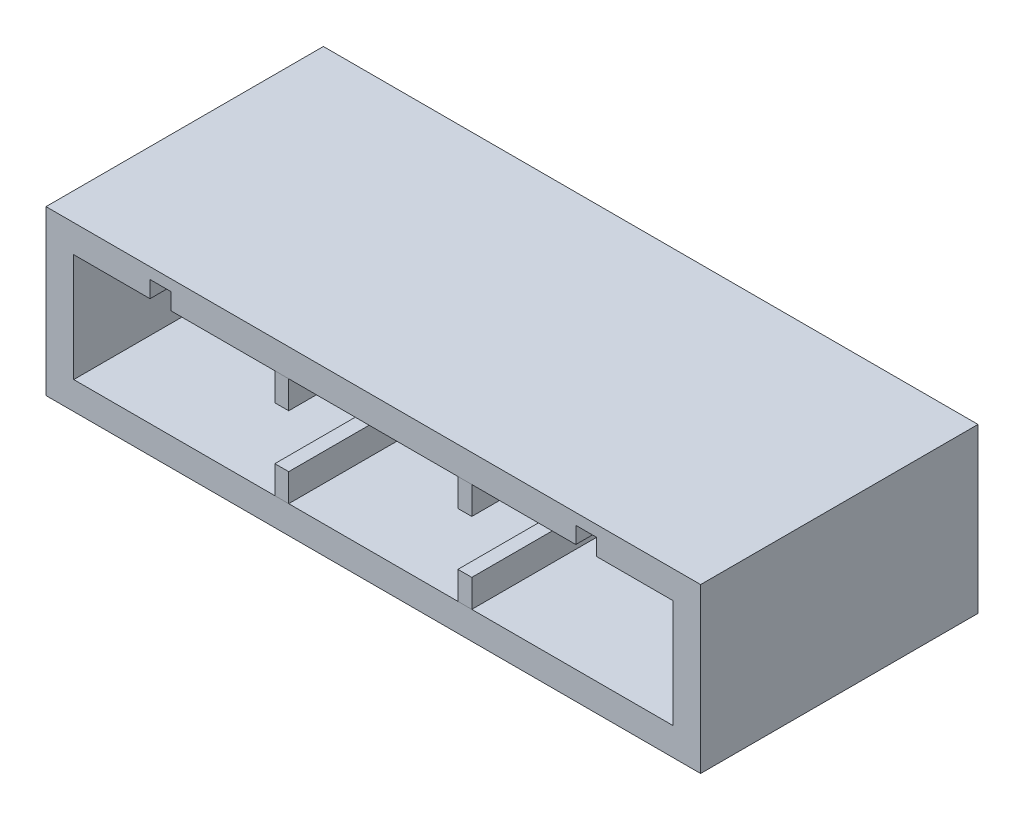
ISO-10303-21;
HEADER;
FILE_DESCRIPTION(('STEP AP214'),'2;1');
FILE_NAME('part.step','',(''),(''),'','','');
FILE_SCHEMA(('AUTOMOTIVE_DESIGN { 1 0 10303 214 1 1 1 1 }'));
ENDSEC;
DATA;
#1=APPLICATION_CONTEXT('core data for automotive mechanical design processes');
#2=APPLICATION_PROTOCOL_DEFINITION('international standard','automotive_design',2000,#1);
#3=PRODUCT_CONTEXT('',#1,'mechanical');
#4=PRODUCT('Part','Part','',(#3));
#5=PRODUCT_RELATED_PRODUCT_CATEGORY('part','',(#4));
#6=PRODUCT_DEFINITION_FORMATION('','',#4);
#7=PRODUCT_DEFINITION_CONTEXT('part definition',#1,'design');
#8=PRODUCT_DEFINITION('design','',#6,#7);
#9=PRODUCT_DEFINITION_SHAPE('','',#8);
#10=(LENGTH_UNIT() NAMED_UNIT(*) SI_UNIT(.MILLI.,.METRE.));
#11=(NAMED_UNIT(*) PLANE_ANGLE_UNIT() SI_UNIT($,.RADIAN.));
#12=(NAMED_UNIT(*) SI_UNIT($,.STERADIAN.) SOLID_ANGLE_UNIT());
#13=UNCERTAINTY_MEASURE_WITH_UNIT(LENGTH_MEASURE(1.E-05),#10,'distance_accuracy_value','');
#14=(GEOMETRIC_REPRESENTATION_CONTEXT(3) GLOBAL_UNCERTAINTY_ASSIGNED_CONTEXT((#13)) GLOBAL_UNIT_ASSIGNED_CONTEXT((#10,
#11,#12)) REPRESENTATION_CONTEXT('',''));
#15=CARTESIAN_POINT('',(0.,0.,0.));
#16=DIRECTION('',(0.,0.,1.));
#17=DIRECTION('',(1.,0.,0.));
#18=AXIS2_PLACEMENT_3D('',#15,#16,#17);
#19=CARTESIAN_POINT('',(7.09999999999999,-12.860315389769,0.));
#20=DIRECTION('',(0.,-1.,0.));
#21=DIRECTION('',(0.,0.,-1.));
#22=AXIS2_PLACEMENT_3D('',#19,#20,#21);
#23=PLANE('',#22);
#24=DIRECTION('',(1.,0.,0.));
#25=VECTOR('',#24,1.);
#26=CARTESIAN_POINT('',(7.09999999999999,-12.860315389769,20.));
#27=LINE('',#26,#25);
#28=CARTESIAN_POINT('',(6.09999999999999,-12.860315389769,20.));
#29=VERTEX_POINT('',#28);
#30=CARTESIAN_POINT('',(7.09999999999999,-12.860315389769,20.));
#31=VERTEX_POINT('',#30);
#32=EDGE_CURVE('E12',#29,#31,#27,.T.);
#33=ORIENTED_EDGE('',*,*,#32,.F.);
#34=DIRECTION('',(0.,0.,1.));
#35=VECTOR('',#34,1.);
#36=CARTESIAN_POINT('',(6.09999999999999,-12.860315389769,0.));
#37=LINE('',#36,#35);
#38=CARTESIAN_POINT('',(6.09999999999999,-12.860315389769,0.));
#39=VERTEX_POINT('',#38);
#40=EDGE_CURVE('E101',#39,#29,#37,.T.);
#41=ORIENTED_EDGE('',*,*,#40,.F.);
#42=DIRECTION('',(1.,0.,0.));
#43=VECTOR('',#42,1.);
#44=CARTESIAN_POINT('',(7.09999999999999,-12.860315389769,0.));
#45=LINE('',#44,#43);
#46=CARTESIAN_POINT('',(7.09999999999999,-12.860315389769,0.));
#47=VERTEX_POINT('',#46);
#48=EDGE_CURVE('E58',#39,#47,#45,.T.);
#49=ORIENTED_EDGE('',*,*,#48,.T.);
#50=DIRECTION('',(0.,0.,1.));
#51=VECTOR('',#50,1.);
#52=CARTESIAN_POINT('',(7.09999999999999,-12.860315389769,0.));
#53=LINE('',#52,#51);
#54=EDGE_CURVE('E73',#47,#31,#53,.T.);
#55=ORIENTED_EDGE('',*,*,#54,.T.);
#56=EDGE_LOOP('',(#33,#41,#49,#55));
#57=FACE_BOUND('',#56,.T.);
#58=ADVANCED_FACE('F54',(#57),#23,.T.);
#59=CARTESIAN_POINT('',(6.09999999999999,-12.860315389769,0.));
#60=DIRECTION('',(-1.,0.,0.));
#61=DIRECTION('',(0.,-1.,0.));
#62=AXIS2_PLACEMENT_3D('',#59,#60,#61);
#63=PLANE('',#62);
#64=DIRECTION('',(0.,-1.,0.));
#65=VECTOR('',#64,1.);
#66=CARTESIAN_POINT('',(6.09999999999999,-12.860315389769,20.));
#67=LINE('',#66,#65);
#68=CARTESIAN_POINT('',(6.1,-10.860315389769,20.));
#69=VERTEX_POINT('',#68);
#70=EDGE_CURVE('E114',#69,#29,#67,.T.);
#71=ORIENTED_EDGE('',*,*,#70,.F.);
#72=DIRECTION('',(0.,0.,1.));
#73=VECTOR('',#72,1.);
#74=CARTESIAN_POINT('',(6.1,-10.860315389769,0.));
#75=LINE('',#74,#73);
#76=CARTESIAN_POINT('',(6.1,-10.860315389769,0.));
#77=VERTEX_POINT('',#76);
#78=EDGE_CURVE('E103',#77,#69,#75,.T.);
#79=ORIENTED_EDGE('',*,*,#78,.F.);
#80=DIRECTION('',(0.,-1.,0.));
#81=VECTOR('',#80,1.);
#82=CARTESIAN_POINT('',(6.09999999999999,-12.860315389769,0.));
#83=LINE('',#82,#81);
#84=EDGE_CURVE('E122',#77,#39,#83,.T.);
#85=ORIENTED_EDGE('',*,*,#84,.T.);
#86=ORIENTED_EDGE('',*,*,#40,.T.);
#87=EDGE_LOOP('',(#71,#79,#85,#86));
#88=FACE_BOUND('',#87,.T.);
#89=ADVANCED_FACE('F116',(#88),#63,.T.);
#90=CARTESIAN_POINT('',(6.1,-10.860315389769,0.));
#91=DIRECTION('',(0.,1.,0.));
#92=DIRECTION('',(0.,0.,1.));
#93=AXIS2_PLACEMENT_3D('',#90,#91,#92);
#94=PLANE('',#93);
#95=DIRECTION('',(-1.,0.,0.));
#96=VECTOR('',#95,1.);
#97=CARTESIAN_POINT('',(6.1,-10.860315389769,20.));
#98=LINE('',#97,#96);
#99=CARTESIAN_POINT('',(7.1,-10.860315389769,20.));
#100=VERTEX_POINT('',#99);
#101=EDGE_CURVE('E106',#100,#69,#98,.T.);
#102=ORIENTED_EDGE('',*,*,#101,.F.);
#103=DIRECTION('',(0.,0.,1.));
#104=VECTOR('',#103,1.);
#105=CARTESIAN_POINT('',(7.1,-10.860315389769,0.));
#106=LINE('',#105,#104);
#107=CARTESIAN_POINT('',(7.1,-10.860315389769,0.));
#108=VERTEX_POINT('',#107);
#109=EDGE_CURVE('E90',#108,#100,#106,.T.);
#110=ORIENTED_EDGE('',*,*,#109,.F.);
#111=DIRECTION('',(-1.,0.,0.));
#112=VECTOR('',#111,1.);
#113=CARTESIAN_POINT('',(6.1,-10.860315389769,0.));
#114=LINE('',#113,#112);
#115=EDGE_CURVE('E108',#108,#77,#114,.T.);
#116=ORIENTED_EDGE('',*,*,#115,.T.);
#117=ORIENTED_EDGE('',*,*,#78,.T.);
#118=EDGE_LOOP('',(#102,#110,#116,#117));
#119=FACE_BOUND('',#118,.T.);
#120=ADVANCED_FACE('F105',(#119),#94,.T.);
#121=CARTESIAN_POINT('',(7.1,-10.860315389769,0.));
#122=DIRECTION('',(1.,0.,0.));
#123=DIRECTION('',(0.,1.,0.));
#124=AXIS2_PLACEMENT_3D('',#121,#122,#123);
#125=PLANE('',#124);
#126=DIRECTION('',(0.,1.,0.));
#127=VECTOR('',#126,1.);
#128=CARTESIAN_POINT('',(7.1,-10.860315389769,20.));
#129=LINE('',#128,#127);
#130=EDGE_CURVE('E64',#31,#100,#129,.T.);
#131=ORIENTED_EDGE('',*,*,#130,.F.);
#132=ORIENTED_EDGE('',*,*,#54,.F.);
#133=DIRECTION('',(0.,1.,0.));
#134=VECTOR('',#133,1.);
#135=CARTESIAN_POINT('',(7.1,-10.860315389769,0.));
#136=LINE('',#135,#134);
#137=EDGE_CURVE('E118',#47,#108,#136,.T.);
#138=ORIENTED_EDGE('',*,*,#137,.T.);
#139=ORIENTED_EDGE('',*,*,#109,.T.);
#140=EDGE_LOOP('',(#131,#132,#138,#139));
#141=FACE_BOUND('',#140,.T.);
#142=ADVANCED_FACE('F124',(#141),#125,.T.);
#143=CARTESIAN_POINT('',(0.,0.,0.));
#144=DIRECTION('',(0.,0.,-1.));
#145=DIRECTION('',(-1.,0.,0.));
#146=AXIS2_PLACEMENT_3D('',#143,#144,#145);
#147=PLANE('',#146);
#148=ORIENTED_EDGE('',*,*,#48,.F.);
#149=ORIENTED_EDGE('',*,*,#84,.F.);
#150=ORIENTED_EDGE('',*,*,#115,.F.);
#151=ORIENTED_EDGE('',*,*,#137,.F.);
#152=EDGE_LOOP('',(#148,#149,#150,#151));
#153=FACE_BOUND('',#152,.T.);
#154=ADVANCED_FACE('F56',(#153),#147,.T.);
#155=CARTESIAN_POINT('',(0.,0.,20.));
#156=DIRECTION('',(0.,0.,-1.));
#157=DIRECTION('',(-1.,0.,0.));
#158=AXIS2_PLACEMENT_3D('',#155,#156,#157);
#159=PLANE('',#158);
#160=ORIENTED_EDGE('',*,*,#32,.T.);
#161=ORIENTED_EDGE('',*,*,#130,.T.);
#162=ORIENTED_EDGE('',*,*,#101,.T.);
#163=ORIENTED_EDGE('',*,*,#70,.T.);
#164=EDGE_LOOP('',(#160,#161,#162,#163));
#165=FACE_BOUND('',#164,.T.);
#166=ADVANCED_FACE('F113',(#165),#159,.F.);
#167=CLOSED_SHELL('',(#58,#89,#120,#142,#154,#166));
#168=MANIFOLD_SOLID_BREP('B2',#167);
#169=CARTESIAN_POINT('',(-6.1,-12.860315389769,0.));
#170=DIRECTION('',(0.,-1.,0.));
#171=DIRECTION('',(0.,0.,-1.));
#172=AXIS2_PLACEMENT_3D('',#169,#170,#171);
#173=PLANE('',#172);
#174=DIRECTION('',(1.,0.,0.));
#175=VECTOR('',#174,1.);
#176=CARTESIAN_POINT('',(-6.1,-12.860315389769,20.));
#177=LINE('',#176,#175);
#178=CARTESIAN_POINT('',(-7.1,-12.860315389769,20.));
#179=VERTEX_POINT('',#178);
#180=CARTESIAN_POINT('',(-6.1,-12.860315389769,20.));
#181=VERTEX_POINT('',#180);
#182=EDGE_CURVE('E52',#179,#181,#177,.T.);
#183=ORIENTED_EDGE('',*,*,#182,.F.);
#184=DIRECTION('',(0.,0.,1.));
#185=VECTOR('',#184,1.);
#186=CARTESIAN_POINT('',(-7.1,-12.860315389769,0.));
#187=LINE('',#186,#185);
#188=CARTESIAN_POINT('',(-7.1,-12.860315389769,0.));
#189=VERTEX_POINT('',#188);
#190=EDGE_CURVE('E235',#189,#179,#187,.T.);
#191=ORIENTED_EDGE('',*,*,#190,.F.);
#192=DIRECTION('',(1.,0.,0.));
#193=VECTOR('',#192,1.);
#194=CARTESIAN_POINT('',(-6.1,-12.860315389769,0.));
#195=LINE('',#194,#193);
#196=CARTESIAN_POINT('',(-6.1,-12.860315389769,0.));
#197=VERTEX_POINT('',#196);
#198=EDGE_CURVE('E192',#189,#197,#195,.T.);
#199=ORIENTED_EDGE('',*,*,#198,.T.);
#200=DIRECTION('',(0.,0.,1.));
#201=VECTOR('',#200,1.);
#202=CARTESIAN_POINT('',(-6.1,-12.860315389769,0.));
#203=LINE('',#202,#201);
#204=EDGE_CURVE('E207',#197,#181,#203,.T.);
#205=ORIENTED_EDGE('',*,*,#204,.T.);
#206=EDGE_LOOP('',(#183,#191,#199,#205));
#207=FACE_BOUND('',#206,.T.);
#208=ADVANCED_FACE('F188',(#207),#173,.T.);
#209=CARTESIAN_POINT('',(-7.1,-12.860315389769,0.));
#210=DIRECTION('',(-1.,0.,0.));
#211=DIRECTION('',(0.,-1.,0.));
#212=AXIS2_PLACEMENT_3D('',#209,#210,#211);
#213=PLANE('',#212);
#214=DIRECTION('',(0.,-1.,0.));
#215=VECTOR('',#214,1.);
#216=CARTESIAN_POINT('',(-7.1,-12.860315389769,20.));
#217=LINE('',#216,#215);
#218=CARTESIAN_POINT('',(-7.1,-10.860315389769,20.));
#219=VERTEX_POINT('',#218);
#220=EDGE_CURVE('E248',#219,#179,#217,.T.);
#221=ORIENTED_EDGE('',*,*,#220,.F.);
#222=DIRECTION('',(0.,0.,1.));
#223=VECTOR('',#222,1.);
#224=CARTESIAN_POINT('',(-7.1,-10.860315389769,0.));
#225=LINE('',#224,#223);
#226=CARTESIAN_POINT('',(-7.1,-10.860315389769,0.));
#227=VERTEX_POINT('',#226);
#228=EDGE_CURVE('E237',#227,#219,#225,.T.);
#229=ORIENTED_EDGE('',*,*,#228,.F.);
#230=DIRECTION('',(0.,-1.,0.));
#231=VECTOR('',#230,1.);
#232=CARTESIAN_POINT('',(-7.1,-12.860315389769,0.));
#233=LINE('',#232,#231);
#234=EDGE_CURVE('E256',#227,#189,#233,.T.);
#235=ORIENTED_EDGE('',*,*,#234,.T.);
#236=ORIENTED_EDGE('',*,*,#190,.T.);
#237=EDGE_LOOP('',(#221,#229,#235,#236));
#238=FACE_BOUND('',#237,.T.);
#239=ADVANCED_FACE('F250',(#238),#213,.T.);
#240=CARTESIAN_POINT('',(-7.1,-10.860315389769,0.));
#241=DIRECTION('',(0.,1.,0.));
#242=DIRECTION('',(0.,0.,1.));
#243=AXIS2_PLACEMENT_3D('',#240,#241,#242);
#244=PLANE('',#243);
#245=DIRECTION('',(-1.,0.,0.));
#246=VECTOR('',#245,1.);
#247=CARTESIAN_POINT('',(-7.1,-10.860315389769,20.));
#248=LINE('',#247,#246);
#249=CARTESIAN_POINT('',(-6.1,-10.860315389769,20.));
#250=VERTEX_POINT('',#249);
#251=EDGE_CURVE('E240',#250,#219,#248,.T.);
#252=ORIENTED_EDGE('',*,*,#251,.F.);
#253=DIRECTION('',(0.,0.,1.));
#254=VECTOR('',#253,1.);
#255=CARTESIAN_POINT('',(-6.1,-10.860315389769,0.));
#256=LINE('',#255,#254);
#257=CARTESIAN_POINT('',(-6.1,-10.860315389769,0.));
#258=VERTEX_POINT('',#257);
#259=EDGE_CURVE('E224',#258,#250,#256,.T.);
#260=ORIENTED_EDGE('',*,*,#259,.F.);
#261=DIRECTION('',(-1.,0.,0.));
#262=VECTOR('',#261,1.);
#263=CARTESIAN_POINT('',(-7.1,-10.860315389769,0.));
#264=LINE('',#263,#262);
#265=EDGE_CURVE('E242',#258,#227,#264,.T.);
#266=ORIENTED_EDGE('',*,*,#265,.T.);
#267=ORIENTED_EDGE('',*,*,#228,.T.);
#268=EDGE_LOOP('',(#252,#260,#266,#267));
#269=FACE_BOUND('',#268,.T.);
#270=ADVANCED_FACE('F239',(#269),#244,.T.);
#271=CARTESIAN_POINT('',(-6.1,-10.860315389769,0.));
#272=DIRECTION('',(1.,0.,0.));
#273=DIRECTION('',(0.,0.,-1.));
#274=AXIS2_PLACEMENT_3D('',#271,#272,#273);
#275=PLANE('',#274);
#276=DIRECTION('',(0.,1.,0.));
#277=VECTOR('',#276,1.);
#278=CARTESIAN_POINT('',(-6.1,-10.860315389769,20.));
#279=LINE('',#278,#277);
#280=EDGE_CURVE('E198',#181,#250,#279,.T.);
#281=ORIENTED_EDGE('',*,*,#280,.F.);
#282=ORIENTED_EDGE('',*,*,#204,.F.);
#283=DIRECTION('',(0.,1.,0.));
#284=VECTOR('',#283,1.);
#285=CARTESIAN_POINT('',(-6.1,-10.860315389769,0.));
#286=LINE('',#285,#284);
#287=EDGE_CURVE('E252',#197,#258,#286,.T.);
#288=ORIENTED_EDGE('',*,*,#287,.T.);
#289=ORIENTED_EDGE('',*,*,#259,.T.);
#290=EDGE_LOOP('',(#281,#282,#288,#289));
#291=FACE_BOUND('',#290,.T.);
#292=ADVANCED_FACE('F258',(#291),#275,.T.);
#293=CARTESIAN_POINT('',(0.,0.,0.));
#294=DIRECTION('',(0.,0.,-1.));
#295=DIRECTION('',(-1.,0.,0.));
#296=AXIS2_PLACEMENT_3D('',#293,#294,#295);
#297=PLANE('',#296);
#298=ORIENTED_EDGE('',*,*,#198,.F.);
#299=ORIENTED_EDGE('',*,*,#234,.F.);
#300=ORIENTED_EDGE('',*,*,#265,.F.);
#301=ORIENTED_EDGE('',*,*,#287,.F.);
#302=EDGE_LOOP('',(#298,#299,#300,#301));
#303=FACE_BOUND('',#302,.T.);
#304=ADVANCED_FACE('F190',(#303),#297,.T.);
#305=CARTESIAN_POINT('',(0.,0.,20.));
#306=DIRECTION('',(0.,0.,-1.));
#307=DIRECTION('',(-1.,0.,0.));
#308=AXIS2_PLACEMENT_3D('',#305,#306,#307);
#309=PLANE('',#308);
#310=ORIENTED_EDGE('',*,*,#182,.T.);
#311=ORIENTED_EDGE('',*,*,#280,.T.);
#312=ORIENTED_EDGE('',*,*,#251,.T.);
#313=ORIENTED_EDGE('',*,*,#220,.T.);
#314=EDGE_LOOP('',(#310,#311,#312,#313));
#315=FACE_BOUND('',#314,.T.);
#316=ADVANCED_FACE('F247',(#315),#309,.F.);
#317=CLOSED_SHELL('',(#208,#239,#270,#292,#304,#316));
#318=MANIFOLD_SOLID_BREP('B6',#317);
#319=CARTESIAN_POINT('',(6.1,-5.06031538976903,0.));
#320=DIRECTION('',(0.,1.,0.));
#321=DIRECTION('',(0.,0.,1.));
#322=AXIS2_PLACEMENT_3D('',#319,#320,#321);
#323=PLANE('',#322);
#324=DIRECTION('',(-1.,0.,0.));
#325=VECTOR('',#324,1.);
#326=CARTESIAN_POINT('',(6.1,-5.06031538976903,20.));
#327=LINE('',#326,#325);
#328=CARTESIAN_POINT('',(7.1,-5.06031538976903,20.));
#329=VERTEX_POINT('',#328);
#330=CARTESIAN_POINT('',(6.1,-5.06031538976903,20.));
#331=VERTEX_POINT('',#330);
#332=EDGE_CURVE('E186',#329,#331,#327,.T.);
#333=ORIENTED_EDGE('',*,*,#332,.F.);
#334=DIRECTION('',(0.,0.,1.));
#335=VECTOR('',#334,1.);
#336=CARTESIAN_POINT('',(7.1,-5.06031538976903,0.));
#337=LINE('',#336,#335);
#338=CARTESIAN_POINT('',(7.1,-5.06031538976903,0.));
#339=VERTEX_POINT('',#338);
#340=EDGE_CURVE('E369',#339,#329,#337,.T.);
#341=ORIENTED_EDGE('',*,*,#340,.F.);
#342=DIRECTION('',(-1.,0.,0.));
#343=VECTOR('',#342,1.);
#344=CARTESIAN_POINT('',(6.1,-5.06031538976903,0.));
#345=LINE('',#344,#343);
#346=CARTESIAN_POINT('',(6.1,-5.06031538976903,0.));
#347=VERTEX_POINT('',#346);
#348=EDGE_CURVE('E326',#339,#347,#345,.T.);
#349=ORIENTED_EDGE('',*,*,#348,.T.);
#350=DIRECTION('',(0.,0.,1.));
#351=VECTOR('',#350,1.);
#352=CARTESIAN_POINT('',(6.1,-5.06031538976903,0.));
#353=LINE('',#352,#351);
#354=EDGE_CURVE('E341',#347,#331,#353,.T.);
#355=ORIENTED_EDGE('',*,*,#354,.T.);
#356=EDGE_LOOP('',(#333,#341,#349,#355));
#357=FACE_BOUND('',#356,.T.);
#358=ADVANCED_FACE('F322',(#357),#323,.T.);
#359=CARTESIAN_POINT('',(7.1,-5.06031538976903,0.));
#360=DIRECTION('',(1.,0.,0.));
#361=DIRECTION('',(0.,0.,-1.));
#362=AXIS2_PLACEMENT_3D('',#359,#360,#361);
#363=PLANE('',#362);
#364=DIRECTION('',(0.,1.,0.));
#365=VECTOR('',#364,1.);
#366=CARTESIAN_POINT('',(7.1,-5.06031538976903,20.));
#367=LINE('',#366,#365);
#368=CARTESIAN_POINT('',(7.1,-7.06031538976903,20.));
#369=VERTEX_POINT('',#368);
#370=EDGE_CURVE('E382',#369,#329,#367,.T.);
#371=ORIENTED_EDGE('',*,*,#370,.F.);
#372=DIRECTION('',(0.,0.,1.));
#373=VECTOR('',#372,1.);
#374=CARTESIAN_POINT('',(7.1,-7.06031538976903,0.));
#375=LINE('',#374,#373);
#376=CARTESIAN_POINT('',(7.1,-7.06031538976903,0.));
#377=VERTEX_POINT('',#376);
#378=EDGE_CURVE('E371',#377,#369,#375,.T.);
#379=ORIENTED_EDGE('',*,*,#378,.F.);
#380=DIRECTION('',(0.,1.,0.));
#381=VECTOR('',#380,1.);
#382=CARTESIAN_POINT('',(7.1,-5.06031538976903,0.));
#383=LINE('',#382,#381);
#384=EDGE_CURVE('E390',#377,#339,#383,.T.);
#385=ORIENTED_EDGE('',*,*,#384,.T.);
#386=ORIENTED_EDGE('',*,*,#340,.T.);
#387=EDGE_LOOP('',(#371,#379,#385,#386));
#388=FACE_BOUND('',#387,.T.);
#389=ADVANCED_FACE('F384',(#388),#363,.T.);
#390=CARTESIAN_POINT('',(7.1,-7.06031538976903,0.));
#391=DIRECTION('',(0.,-1.,0.));
#392=DIRECTION('',(0.,0.,-1.));
#393=AXIS2_PLACEMENT_3D('',#390,#391,#392);
#394=PLANE('',#393);
#395=DIRECTION('',(1.,0.,0.));
#396=VECTOR('',#395,1.);
#397=CARTESIAN_POINT('',(7.1,-7.06031538976903,20.));
#398=LINE('',#397,#396);
#399=CARTESIAN_POINT('',(6.1,-7.06031538976903,20.));
#400=VERTEX_POINT('',#399);
#401=EDGE_CURVE('E374',#400,#369,#398,.T.);
#402=ORIENTED_EDGE('',*,*,#401,.F.);
#403=DIRECTION('',(0.,0.,1.));
#404=VECTOR('',#403,1.);
#405=CARTESIAN_POINT('',(6.1,-7.06031538976903,0.));
#406=LINE('',#405,#404);
#407=CARTESIAN_POINT('',(6.1,-7.06031538976903,0.));
#408=VERTEX_POINT('',#407);
#409=EDGE_CURVE('E358',#408,#400,#406,.T.);
#410=ORIENTED_EDGE('',*,*,#409,.F.);
#411=DIRECTION('',(1.,0.,0.));
#412=VECTOR('',#411,1.);
#413=CARTESIAN_POINT('',(7.1,-7.06031538976903,0.));
#414=LINE('',#413,#412);
#415=EDGE_CURVE('E376',#408,#377,#414,.T.);
#416=ORIENTED_EDGE('',*,*,#415,.T.);
#417=ORIENTED_EDGE('',*,*,#378,.T.);
#418=EDGE_LOOP('',(#402,#410,#416,#417));
#419=FACE_BOUND('',#418,.T.);
#420=ADVANCED_FACE('F373',(#419),#394,.T.);
#421=CARTESIAN_POINT('',(6.1,-7.06031538976903,0.));
#422=DIRECTION('',(-1.,0.,0.));
#423=DIRECTION('',(0.,-1.,0.));
#424=AXIS2_PLACEMENT_3D('',#421,#422,#423);
#425=PLANE('',#424);
#426=DIRECTION('',(0.,-1.,0.));
#427=VECTOR('',#426,1.);
#428=CARTESIAN_POINT('',(6.1,-7.06031538976903,20.));
#429=LINE('',#428,#427);
#430=EDGE_CURVE('E332',#331,#400,#429,.T.);
#431=ORIENTED_EDGE('',*,*,#430,.F.);
#432=ORIENTED_EDGE('',*,*,#354,.F.);
#433=DIRECTION('',(0.,-1.,0.));
#434=VECTOR('',#433,1.);
#435=CARTESIAN_POINT('',(6.1,-7.06031538976903,0.));
#436=LINE('',#435,#434);
#437=EDGE_CURVE('E386',#347,#408,#436,.T.);
#438=ORIENTED_EDGE('',*,*,#437,.T.);
#439=ORIENTED_EDGE('',*,*,#409,.T.);
#440=EDGE_LOOP('',(#431,#432,#438,#439));
#441=FACE_BOUND('',#440,.T.);
#442=ADVANCED_FACE('F392',(#441),#425,.T.);
#443=CARTESIAN_POINT('',(0.,0.,0.));
#444=DIRECTION('',(0.,0.,-1.));
#445=DIRECTION('',(-1.,0.,0.));
#446=AXIS2_PLACEMENT_3D('',#443,#444,#445);
#447=PLANE('',#446);
#448=ORIENTED_EDGE('',*,*,#348,.F.);
#449=ORIENTED_EDGE('',*,*,#384,.F.);
#450=ORIENTED_EDGE('',*,*,#415,.F.);
#451=ORIENTED_EDGE('',*,*,#437,.F.);
#452=EDGE_LOOP('',(#448,#449,#450,#451));
#453=FACE_BOUND('',#452,.T.);
#454=ADVANCED_FACE('F324',(#453),#447,.T.);
#455=CARTESIAN_POINT('',(0.,0.,20.));
#456=DIRECTION('',(0.,0.,-1.));
#457=DIRECTION('',(-1.,0.,0.));
#458=AXIS2_PLACEMENT_3D('',#455,#456,#457);
#459=PLANE('',#458);
#460=ORIENTED_EDGE('',*,*,#332,.T.);
#461=ORIENTED_EDGE('',*,*,#430,.T.);
#462=ORIENTED_EDGE('',*,*,#401,.T.);
#463=ORIENTED_EDGE('',*,*,#370,.T.);
#464=EDGE_LOOP('',(#460,#461,#462,#463));
#465=FACE_BOUND('',#464,.T.);
#466=ADVANCED_FACE('F381',(#465),#459,.F.);
#467=CLOSED_SHELL('',(#358,#389,#420,#442,#454,#466));
#468=MANIFOLD_SOLID_BREP('B46',#467);
#469=CARTESIAN_POINT('',(-6.1,-5.06031538976903,0.));
#470=DIRECTION('',(0.,1.,0.));
#471=DIRECTION('',(-1.,0.,0.));
#472=AXIS2_PLACEMENT_3D('',#469,#470,#471);
#473=PLANE('',#472);
#474=DIRECTION('',(-1.,0.,0.));
#475=VECTOR('',#474,1.);
#476=CARTESIAN_POINT('',(-6.1,-5.06031538976903,20.));
#477=LINE('',#476,#475);
#478=CARTESIAN_POINT('',(-6.1,-5.06031538976903,20.));
#479=VERTEX_POINT('',#478);
#480=CARTESIAN_POINT('',(-7.1,-5.06031538976903,20.));
#481=VERTEX_POINT('',#480);
#482=EDGE_CURVE('E519',#479,#481,#477,.T.);
#483=ORIENTED_EDGE('',*,*,#482,.F.);
#484=DIRECTION('',(0.,0.,1.));
#485=VECTOR('',#484,1.);
#486=CARTESIAN_POINT('',(-6.1,-5.06031538976903,0.));
#487=LINE('',#486,#485);
#488=CARTESIAN_POINT('',(-6.1,-5.06031538976903,0.));
#489=VERTEX_POINT('',#488);
#490=EDGE_CURVE('E320',#489,#479,#487,.T.);
#491=ORIENTED_EDGE('',*,*,#490,.F.);
#492=DIRECTION('',(-1.,0.,0.));
#493=VECTOR('',#492,1.);
#494=CARTESIAN_POINT('',(-6.1,-5.06031538976903,0.));
#495=LINE('',#494,#493);
#496=CARTESIAN_POINT('',(-7.1,-5.06031538976903,0.));
#497=VERTEX_POINT('',#496);
#498=EDGE_CURVE('E513',#489,#497,#495,.T.);
#499=ORIENTED_EDGE('',*,*,#498,.T.);
#500=DIRECTION('',(0.,0.,1.));
#501=VECTOR('',#500,1.);
#502=CARTESIAN_POINT('',(-7.1,-5.06031538976903,0.));
#503=LINE('',#502,#501);
#504=EDGE_CURVE('E458',#497,#481,#503,.T.);
#505=ORIENTED_EDGE('',*,*,#504,.T.);
#506=EDGE_LOOP('',(#483,#491,#499,#505));
#507=FACE_BOUND('',#506,.T.);
#508=ADVANCED_FACE('F455',(#507),#473,.T.);
#509=CARTESIAN_POINT('',(-6.1,-7.06031538976903,0.));
#510=DIRECTION('',(1.,0.,0.));
#511=DIRECTION('',(0.,1.,0.));
#512=AXIS2_PLACEMENT_3D('',#509,#510,#511);
#513=PLANE('',#512);
#514=DIRECTION('',(0.,1.,0.));
#515=VECTOR('',#514,1.);
#516=CARTESIAN_POINT('',(-6.1,-7.06031538976903,20.));
#517=LINE('',#516,#515);
#518=CARTESIAN_POINT('',(-6.1,-7.06031538976903,20.));
#519=VERTEX_POINT('',#518);
#520=EDGE_CURVE('E515',#519,#479,#517,.T.);
#521=ORIENTED_EDGE('',*,*,#520,.F.);
#522=DIRECTION('',(0.,0.,1.));
#523=VECTOR('',#522,1.);
#524=CARTESIAN_POINT('',(-6.1,-7.06031538976903,0.));
#525=LINE('',#524,#523);
#526=CARTESIAN_POINT('',(-6.1,-7.06031538976903,0.));
#527=VERTEX_POINT('',#526);
#528=EDGE_CURVE('E464',#527,#519,#525,.T.);
#529=ORIENTED_EDGE('',*,*,#528,.F.);
#530=DIRECTION('',(0.,1.,0.));
#531=VECTOR('',#530,1.);
#532=CARTESIAN_POINT('',(-6.1,-7.06031538976903,0.));
#533=LINE('',#532,#531);
#534=EDGE_CURVE('E510',#527,#489,#533,.T.);
#535=ORIENTED_EDGE('',*,*,#534,.T.);
#536=ORIENTED_EDGE('',*,*,#490,.T.);
#537=EDGE_LOOP('',(#521,#529,#535,#536));
#538=FACE_BOUND('',#537,.T.);
#539=ADVANCED_FACE('F529',(#538),#513,.T.);
#540=CARTESIAN_POINT('',(-7.1,-7.06031538976903,0.));
#541=DIRECTION('',(0.,-1.,0.));
#542=DIRECTION('',(0.,0.,-1.));
#543=AXIS2_PLACEMENT_3D('',#540,#541,#542);
#544=PLANE('',#543);
#545=DIRECTION('',(1.,0.,0.));
#546=VECTOR('',#545,1.);
#547=CARTESIAN_POINT('',(-7.1,-7.06031538976903,20.));
#548=LINE('',#547,#546);
#549=CARTESIAN_POINT('',(-7.1,-7.06031538976903,20.));
#550=VERTEX_POINT('',#549);
#551=EDGE_CURVE('E505',#550,#519,#548,.T.);
#552=ORIENTED_EDGE('',*,*,#551,.F.);
#553=DIRECTION('',(0.,0.,1.));
#554=VECTOR('',#553,1.);
#555=CARTESIAN_POINT('',(-7.1,-7.06031538976903,0.));
#556=LINE('',#555,#554);
#557=CARTESIAN_POINT('',(-7.1,-7.06031538976903,0.));
#558=VERTEX_POINT('',#557);
#559=EDGE_CURVE('E500',#558,#550,#556,.T.);
#560=ORIENTED_EDGE('',*,*,#559,.F.);
#561=DIRECTION('',(1.,0.,0.));
#562=VECTOR('',#561,1.);
#563=CARTESIAN_POINT('',(-7.1,-7.06031538976903,0.));
#564=LINE('',#563,#562);
#565=EDGE_CURVE('E503',#558,#527,#564,.T.);
#566=ORIENTED_EDGE('',*,*,#565,.T.);
#567=ORIENTED_EDGE('',*,*,#528,.T.);
#568=EDGE_LOOP('',(#552,#560,#566,#567));
#569=FACE_BOUND('',#568,.T.);
#570=ADVANCED_FACE('F502',(#569),#544,.T.);
#571=CARTESIAN_POINT('',(-7.1,-5.06031538976903,0.));
#572=DIRECTION('',(-1.,0.,0.));
#573=DIRECTION('',(0.,0.,1.));
#574=AXIS2_PLACEMENT_3D('',#571,#572,#573);
#575=PLANE('',#574);
#576=DIRECTION('',(0.,-1.,0.));
#577=VECTOR('',#576,1.);
#578=CARTESIAN_POINT('',(-7.1,-5.06031538976903,20.));
#579=LINE('',#578,#577);
#580=EDGE_CURVE('E522',#481,#550,#579,.T.);
#581=ORIENTED_EDGE('',*,*,#580,.F.);
#582=ORIENTED_EDGE('',*,*,#504,.F.);
#583=DIRECTION('',(0.,-1.,0.));
#584=VECTOR('',#583,1.);
#585=CARTESIAN_POINT('',(-7.1,-5.06031538976903,0.));
#586=LINE('',#585,#584);
#587=EDGE_CURVE('E509',#497,#558,#586,.T.);
#588=ORIENTED_EDGE('',*,*,#587,.T.);
#589=ORIENTED_EDGE('',*,*,#559,.T.);
#590=EDGE_LOOP('',(#581,#582,#588,#589));
#591=FACE_BOUND('',#590,.T.);
#592=ADVANCED_FACE('F512',(#591),#575,.T.);
#593=CARTESIAN_POINT('',(0.,0.,0.));
#594=DIRECTION('',(0.,0.,1.));
#595=DIRECTION('',(1.,0.,0.));
#596=AXIS2_PLACEMENT_3D('',#593,#594,#595);
#597=PLANE('',#596);
#598=ORIENTED_EDGE('',*,*,#498,.F.);
#599=ORIENTED_EDGE('',*,*,#534,.F.);
#600=ORIENTED_EDGE('',*,*,#565,.F.);
#601=ORIENTED_EDGE('',*,*,#587,.F.);
#602=EDGE_LOOP('',(#598,#599,#600,#601));
#603=FACE_BOUND('',#602,.T.);
#604=ADVANCED_FACE('F508',(#603),#597,.F.);
#605=CARTESIAN_POINT('',(0.,0.,20.));
#606=DIRECTION('',(0.,0.,1.));
#607=DIRECTION('',(1.,0.,0.));
#608=AXIS2_PLACEMENT_3D('',#605,#606,#607);
#609=PLANE('',#608);
#610=ORIENTED_EDGE('',*,*,#482,.T.);
#611=ORIENTED_EDGE('',*,*,#580,.T.);
#612=ORIENTED_EDGE('',*,*,#551,.T.);
#613=ORIENTED_EDGE('',*,*,#520,.T.);
#614=EDGE_LOOP('',(#610,#611,#612,#613));
#615=FACE_BOUND('',#614,.T.);
#616=ADVANCED_FACE('F528',(#615),#609,.T.);
#617=CLOSED_SHELL('',(#508,#539,#570,#592,#604,#616));
#618=MANIFOLD_SOLID_BREP('B180',#617);
#619=CARTESIAN_POINT('',(-21.6,-5.06031538976903,20.));
#620=DIRECTION('',(0.,-1.,0.));
#621=DIRECTION('',(0.,0.,-1.));
#622=AXIS2_PLACEMENT_3D('',#619,#620,#621);
#623=PLANE('',#622);
#624=DIRECTION('',(0.,0.,1.));
#625=VECTOR('',#624,1.);
#626=CARTESIAN_POINT('',(-16.1,-5.06031538976903,0.));
#627=LINE('',#626,#625);
#628=CARTESIAN_POINT('',(-16.1,-5.06031538976903,0.));
#629=VERTEX_POINT('',#628);
#630=CARTESIAN_POINT('',(-16.1,-5.06031538976903,20.));
#631=VERTEX_POINT('',#630);
#632=EDGE_CURVE('E724',#629,#631,#627,.T.);
#633=ORIENTED_EDGE('',*,*,#632,.T.);
#634=DIRECTION('',(-1.,0.,0.));
#635=VECTOR('',#634,1.);
#636=CARTESIAN_POINT('',(-21.6,-5.06031538976903,20.));
#637=LINE('',#636,#635);
#638=CARTESIAN_POINT('',(-21.6,-5.06031538976903,20.));
#639=VERTEX_POINT('',#638);
#640=EDGE_CURVE('E760',#631,#639,#637,.T.);
#641=ORIENTED_EDGE('',*,*,#640,.T.);
#642=DIRECTION('',(0.,0.,-1.));
#643=VECTOR('',#642,1.);
#644=CARTESIAN_POINT('',(-21.6,-5.06031538976903,20.));
#645=LINE('',#644,#643);
#646=CARTESIAN_POINT('',(-21.6,-5.06031538976903,0.));
#647=VERTEX_POINT('',#646);
#648=EDGE_CURVE('E764',#639,#647,#645,.T.);
#649=ORIENTED_EDGE('',*,*,#648,.T.);
#650=DIRECTION('',(-1.,0.,0.));
#651=VECTOR('',#650,1.);
#652=CARTESIAN_POINT('',(-21.6,-5.06031538976903,0.));
#653=LINE('',#652,#651);
#654=EDGE_CURVE('E774',#629,#647,#653,.T.);
#655=ORIENTED_EDGE('',*,*,#654,.F.);
#656=EDGE_LOOP('',(#633,#641,#649,#655));
#657=FACE_BOUND('',#656,.T.);
#658=ADVANCED_FACE('F579',(#657),#623,.T.);
#659=DIRECTION('',(0.,0.,1.));
#660=VECTOR('',#659,1.);
#661=CARTESIAN_POINT('',(-14.6,-5.06031538976903,0.));
#662=LINE('',#661,#660);
#663=CARTESIAN_POINT('',(-14.6,-5.06031538976903,0.));
#664=VERTEX_POINT('',#663);
#665=CARTESIAN_POINT('',(-14.6,-5.06031538976903,20.));
#666=VERTEX_POINT('',#665);
#667=EDGE_CURVE('E699',#664,#666,#662,.T.);
#668=ORIENTED_EDGE('',*,*,#667,.F.);
#669=CARTESIAN_POINT('',(14.6,-5.06031538976903,0.));
#670=VERTEX_POINT('',#669);
#671=EDGE_CURVE('E714',#670,#664,#653,.T.);
#672=ORIENTED_EDGE('',*,*,#671,.F.);
#673=DIRECTION('',(0.,0.,1.));
#674=VECTOR('',#673,1.);
#675=CARTESIAN_POINT('',(14.6,-5.06031538976903,0.));
#676=LINE('',#675,#674);
#677=CARTESIAN_POINT('',(14.6,-5.06031538976903,20.));
#678=VERTEX_POINT('',#677);
#679=EDGE_CURVE('E737',#670,#678,#676,.T.);
#680=ORIENTED_EDGE('',*,*,#679,.T.);
#681=EDGE_CURVE('E765',#678,#666,#637,.T.);
#682=ORIENTED_EDGE('',*,*,#681,.T.);
#683=EDGE_LOOP('',(#668,#672,#680,#682));
#684=FACE_BOUND('',#683,.T.);
#685=ADVANCED_FACE('F837',(#684),#623,.T.);
#686=CARTESIAN_POINT('',(0.,0.,20.));
#687=DIRECTION('',(0.,0.,-1.));
#688=DIRECTION('',(-1.,0.,0.));
#689=AXIS2_PLACEMENT_3D('',#686,#687,#688);
#690=PLANE('',#689);
#691=DIRECTION('',(0.,1.,0.));
#692=VECTOR('',#691,1.);
#693=CARTESIAN_POINT('',(23.6,-14.860315389769,20.));
#694=LINE('',#693,#692);
#695=CARTESIAN_POINT('',(23.6,-14.860315389769,20.));
#696=VERTEX_POINT('',#695);
#697=CARTESIAN_POINT('',(23.6,-3.06031538976903,20.));
#698=VERTEX_POINT('',#697);
#699=EDGE_CURVE('E787',#696,#698,#694,.T.);
#700=ORIENTED_EDGE('',*,*,#699,.T.);
#701=DIRECTION('',(-1.,0.,0.));
#702=VECTOR('',#701,1.);
#703=CARTESIAN_POINT('',(-23.6,-3.06031538976903,20.));
#704=LINE('',#703,#702);
#705=CARTESIAN_POINT('',(-23.6,-3.06031538976903,20.));
#706=VERTEX_POINT('',#705);
#707=EDGE_CURVE('E790',#698,#706,#704,.T.);
#708=ORIENTED_EDGE('',*,*,#707,.T.);
#709=DIRECTION('',(0.,-1.,0.));
#710=VECTOR('',#709,1.);
#711=CARTESIAN_POINT('',(-23.6,-14.860315389769,20.));
#712=LINE('',#711,#710);
#713=CARTESIAN_POINT('',(-23.6,-14.860315389769,20.));
#714=VERTEX_POINT('',#713);
#715=EDGE_CURVE('E793',#706,#714,#712,.T.);
#716=ORIENTED_EDGE('',*,*,#715,.T.);
#717=DIRECTION('',(1.,0.,0.));
#718=VECTOR('',#717,1.);
#719=CARTESIAN_POINT('',(-23.6,-14.860315389769,20.));
#720=LINE('',#719,#718);
#721=EDGE_CURVE('E795',#714,#696,#720,.T.);
#722=ORIENTED_EDGE('',*,*,#721,.T.);
#723=EDGE_LOOP('',(#700,#708,#716,#722));
#724=FACE_BOUND('',#723,.T.);
#725=ORIENTED_EDGE('',*,*,#640,.F.);
#726=DIRECTION('',(0.,-1.,0.));
#727=VECTOR('',#726,1.);
#728=CARTESIAN_POINT('',(-16.1,-5.06031538976903,20.));
#729=LINE('',#728,#727);
#730=CARTESIAN_POINT('',(-16.1,-3.86031538976903,20.));
#731=VERTEX_POINT('',#730);
#732=EDGE_CURVE('E715',#731,#631,#729,.T.);
#733=ORIENTED_EDGE('',*,*,#732,.F.);
#734=DIRECTION('',(-1.,0.,0.));
#735=VECTOR('',#734,1.);
#736=CARTESIAN_POINT('',(-16.1,-3.86031538976903,20.));
#737=LINE('',#736,#735);
#738=CARTESIAN_POINT('',(-14.6,-3.86031538976903,20.));
#739=VERTEX_POINT('',#738);
#740=EDGE_CURVE('E717',#739,#731,#737,.T.);
#741=ORIENTED_EDGE('',*,*,#740,.F.);
#742=DIRECTION('',(0.,1.,0.));
#743=VECTOR('',#742,1.);
#744=CARTESIAN_POINT('',(-14.6,-3.86031538976903,20.));
#745=LINE('',#744,#743);
#746=EDGE_CURVE('E694',#666,#739,#745,.T.);
#747=ORIENTED_EDGE('',*,*,#746,.F.);
#748=ORIENTED_EDGE('',*,*,#681,.F.);
#749=DIRECTION('',(0.,-1.,0.));
#750=VECTOR('',#749,1.);
#751=CARTESIAN_POINT('',(14.6,-3.86031538976903,20.));
#752=LINE('',#751,#750);
#753=CARTESIAN_POINT('',(14.6,-3.86031538976903,20.));
#754=VERTEX_POINT('',#753);
#755=EDGE_CURVE('E740',#754,#678,#752,.T.);
#756=ORIENTED_EDGE('',*,*,#755,.F.);
#757=DIRECTION('',(-1.,0.,0.));
#758=VECTOR('',#757,1.);
#759=CARTESIAN_POINT('',(16.1,-3.86031538976903,20.));
#760=LINE('',#759,#758);
#761=CARTESIAN_POINT('',(16.1,-3.86031538976903,20.));
#762=VERTEX_POINT('',#761);
#763=EDGE_CURVE('E742',#762,#754,#760,.T.);
#764=ORIENTED_EDGE('',*,*,#763,.F.);
#765=DIRECTION('',(0.,1.,0.));
#766=VECTOR('',#765,1.);
#767=CARTESIAN_POINT('',(16.1,-5.06031538976903,20.));
#768=LINE('',#767,#766);
#769=CARTESIAN_POINT('',(16.1,-5.06031538976903,20.));
#770=VERTEX_POINT('',#769);
#771=EDGE_CURVE('E722',#770,#762,#768,.T.);
#772=ORIENTED_EDGE('',*,*,#771,.F.);
#773=CARTESIAN_POINT('',(21.6,-5.06031538976903,20.));
#774=VERTEX_POINT('',#773);
#775=EDGE_CURVE('E761',#774,#770,#637,.T.);
#776=ORIENTED_EDGE('',*,*,#775,.F.);
#777=DIRECTION('',(0.,1.,0.));
#778=VECTOR('',#777,1.);
#779=CARTESIAN_POINT('',(21.6,-5.06031538976903,20.));
#780=LINE('',#779,#778);
#781=CARTESIAN_POINT('',(21.6,-12.860315389769,20.));
#782=VERTEX_POINT('',#781);
#783=EDGE_CURVE('E757',#782,#774,#780,.T.);
#784=ORIENTED_EDGE('',*,*,#783,.F.);
#785=DIRECTION('',(1.,0.,0.));
#786=VECTOR('',#785,1.);
#787=CARTESIAN_POINT('',(-21.6,-12.860315389769,20.));
#788=LINE('',#787,#786);
#789=CARTESIAN_POINT('',(-21.6,-12.860315389769,20.));
#790=VERTEX_POINT('',#789);
#791=EDGE_CURVE('E754',#790,#782,#788,.T.);
#792=ORIENTED_EDGE('',*,*,#791,.F.);
#793=DIRECTION('',(0.,-1.,0.));
#794=VECTOR('',#793,1.);
#795=CARTESIAN_POINT('',(-21.6,-5.06031538976903,20.));
#796=LINE('',#795,#794);
#797=EDGE_CURVE('E752',#639,#790,#796,.T.);
#798=ORIENTED_EDGE('',*,*,#797,.F.);
#799=EDGE_LOOP('',(#725,#733,#741,#747,#748,#756,#764,#772,#776,#784,#792,#798));
#800=FACE_BOUND('',#799,.T.);
#801=ADVANCED_FACE('F827',(#724,#800),#690,.F.);
#802=CARTESIAN_POINT('',(0.,0.,0.));
#803=DIRECTION('',(0.,0.,-1.));
#804=DIRECTION('',(-1.,0.,0.));
#805=AXIS2_PLACEMENT_3D('',#802,#803,#804);
#806=PLANE('',#805);
#807=DIRECTION('',(0.,-1.,0.));
#808=VECTOR('',#807,1.);
#809=CARTESIAN_POINT('',(-16.1,-5.06031538976903,0.));
#810=LINE('',#809,#808);
#811=CARTESIAN_POINT('',(-16.1,-3.86031538976903,0.));
#812=VERTEX_POINT('',#811);
#813=EDGE_CURVE('E707',#812,#629,#810,.T.);
#814=ORIENTED_EDGE('',*,*,#813,.T.);
#815=ORIENTED_EDGE('',*,*,#654,.T.);
#816=DIRECTION('',(0.,-1.,0.));
#817=VECTOR('',#816,1.);
#818=CARTESIAN_POINT('',(-21.6,-5.06031538976903,0.));
#819=LINE('',#818,#817);
#820=CARTESIAN_POINT('',(-21.6,-12.860315389769,0.));
#821=VERTEX_POINT('',#820);
#822=EDGE_CURVE('E727',#647,#821,#819,.T.);
#823=ORIENTED_EDGE('',*,*,#822,.T.);
#824=DIRECTION('',(1.,0.,0.));
#825=VECTOR('',#824,1.);
#826=CARTESIAN_POINT('',(-21.6,-12.860315389769,0.));
#827=LINE('',#826,#825);
#828=CARTESIAN_POINT('',(21.6,-12.860315389769,0.));
#829=VERTEX_POINT('',#828);
#830=EDGE_CURVE('E768',#821,#829,#827,.T.);
#831=ORIENTED_EDGE('',*,*,#830,.T.);
#832=DIRECTION('',(0.,1.,0.));
#833=VECTOR('',#832,1.);
#834=CARTESIAN_POINT('',(21.6,-5.06031538976903,0.));
#835=LINE('',#834,#833);
#836=CARTESIAN_POINT('',(21.6,-5.06031538976903,0.));
#837=VERTEX_POINT('',#836);
#838=EDGE_CURVE('E771',#829,#837,#835,.T.);
#839=ORIENTED_EDGE('',*,*,#838,.T.);
#840=CARTESIAN_POINT('',(16.1,-5.06031538976903,0.));
#841=VERTEX_POINT('',#840);
#842=EDGE_CURVE('E755',#837,#841,#653,.T.);
#843=ORIENTED_EDGE('',*,*,#842,.T.);
#844=DIRECTION('',(0.,1.,0.));
#845=VECTOR('',#844,1.);
#846=CARTESIAN_POINT('',(16.1,-5.06031538976903,0.));
#847=LINE('',#846,#845);
#848=CARTESIAN_POINT('',(16.1,-3.86031538976903,0.));
#849=VERTEX_POINT('',#848);
#850=EDGE_CURVE('E602',#841,#849,#847,.T.);
#851=ORIENTED_EDGE('',*,*,#850,.T.);
#852=DIRECTION('',(-1.,0.,0.));
#853=VECTOR('',#852,1.);
#854=CARTESIAN_POINT('',(16.1,-3.86031538976903,0.));
#855=LINE('',#854,#853);
#856=CARTESIAN_POINT('',(14.6,-3.86031538976903,0.));
#857=VERTEX_POINT('',#856);
#858=EDGE_CURVE('E748',#849,#857,#855,.T.);
#859=ORIENTED_EDGE('',*,*,#858,.T.);
#860=DIRECTION('',(0.,-1.,0.));
#861=VECTOR('',#860,1.);
#862=CARTESIAN_POINT('',(14.6,-3.86031538976903,0.));
#863=LINE('',#862,#861);
#864=EDGE_CURVE('E732',#857,#670,#863,.T.);
#865=ORIENTED_EDGE('',*,*,#864,.T.);
#866=ORIENTED_EDGE('',*,*,#671,.T.);
#867=DIRECTION('',(0.,1.,0.));
#868=VECTOR('',#867,1.);
#869=CARTESIAN_POINT('',(-14.6,-3.86031538976903,0.));
#870=LINE('',#869,#868);
#871=CARTESIAN_POINT('',(-14.6,-3.86031538976903,0.));
#872=VERTEX_POINT('',#871);
#873=EDGE_CURVE('E594',#664,#872,#870,.T.);
#874=ORIENTED_EDGE('',*,*,#873,.T.);
#875=DIRECTION('',(-1.,0.,0.));
#876=VECTOR('',#875,1.);
#877=CARTESIAN_POINT('',(-16.1,-3.86031538976903,0.));
#878=LINE('',#877,#876);
#879=EDGE_CURVE('E702',#872,#812,#878,.T.);
#880=ORIENTED_EDGE('',*,*,#879,.T.);
#881=EDGE_LOOP('',(#814,#815,#823,#831,#839,#843,#851,#859,#865,#866,#874,#880));
#882=FACE_BOUND('',#881,.T.);
#883=DIRECTION('',(0.,1.,0.));
#884=VECTOR('',#883,1.);
#885=CARTESIAN_POINT('',(23.6,-14.860315389769,0.));
#886=LINE('',#885,#884);
#887=CARTESIAN_POINT('',(23.6,-14.860315389769,0.));
#888=VERTEX_POINT('',#887);
#889=CARTESIAN_POINT('',(23.6,-3.06031538976903,0.));
#890=VERTEX_POINT('',#889);
#891=EDGE_CURVE('E786',#888,#890,#886,.T.);
#892=ORIENTED_EDGE('',*,*,#891,.F.);
#893=DIRECTION('',(1.,0.,0.));
#894=VECTOR('',#893,1.);
#895=CARTESIAN_POINT('',(-23.6,-14.860315389769,0.));
#896=LINE('',#895,#894);
#897=CARTESIAN_POINT('',(-23.6,-14.860315389769,0.));
#898=VERTEX_POINT('',#897);
#899=EDGE_CURVE('E791',#898,#888,#896,.T.);
#900=ORIENTED_EDGE('',*,*,#899,.F.);
#901=DIRECTION('',(0.,-1.,0.));
#902=VECTOR('',#901,1.);
#903=CARTESIAN_POINT('',(-23.6,-14.860315389769,0.));
#904=LINE('',#903,#902);
#905=CARTESIAN_POINT('',(-23.6,-3.06031538976903,0.));
#906=VERTEX_POINT('',#905);
#907=EDGE_CURVE('E802',#906,#898,#904,.T.);
#908=ORIENTED_EDGE('',*,*,#907,.F.);
#909=DIRECTION('',(-1.,0.,0.));
#910=VECTOR('',#909,1.);
#911=CARTESIAN_POINT('',(-23.6,-3.06031538976903,0.));
#912=LINE('',#911,#910);
#913=EDGE_CURVE('E800',#890,#906,#912,.T.);
#914=ORIENTED_EDGE('',*,*,#913,.F.);
#915=EDGE_LOOP('',(#892,#900,#908,#914));
#916=FACE_BOUND('',#915,.T.);
#917=ADVANCED_FACE('F710',(#882,#916),#806,.T.);
#918=CARTESIAN_POINT('',(23.6,-14.860315389769,20.));
#919=DIRECTION('',(-1.,0.,0.));
#920=DIRECTION('',(0.,0.,1.));
#921=AXIS2_PLACEMENT_3D('',#918,#919,#920);
#922=PLANE('',#921);
#923=ORIENTED_EDGE('',*,*,#891,.T.);
#924=DIRECTION('',(0.,0.,-1.));
#925=VECTOR('',#924,1.);
#926=CARTESIAN_POINT('',(23.6,-3.06031538976903,20.));
#927=LINE('',#926,#925);
#928=EDGE_CURVE('E453',#698,#890,#927,.T.);
#929=ORIENTED_EDGE('',*,*,#928,.F.);
#930=ORIENTED_EDGE('',*,*,#699,.F.);
#931=DIRECTION('',(0.,0.,-1.));
#932=VECTOR('',#931,1.);
#933=CARTESIAN_POINT('',(23.6,-14.860315389769,20.));
#934=LINE('',#933,#932);
#935=EDGE_CURVE('E797',#696,#888,#934,.T.);
#936=ORIENTED_EDGE('',*,*,#935,.T.);
#937=EDGE_LOOP('',(#923,#929,#930,#936));
#938=FACE_BOUND('',#937,.T.);
#939=ADVANCED_FACE('F581',(#938),#922,.F.);
#940=CARTESIAN_POINT('',(-23.6,-3.06031538976903,20.));
#941=DIRECTION('',(0.,-1.,0.));
#942=DIRECTION('',(0.,0.,-1.));
#943=AXIS2_PLACEMENT_3D('',#940,#941,#942);
#944=PLANE('',#943);
#945=ORIENTED_EDGE('',*,*,#913,.T.);
#946=DIRECTION('',(0.,0.,-1.));
#947=VECTOR('',#946,1.);
#948=CARTESIAN_POINT('',(-23.6,-3.06031538976903,20.));
#949=LINE('',#948,#947);
#950=EDGE_CURVE('E587',#706,#906,#949,.T.);
#951=ORIENTED_EDGE('',*,*,#950,.F.);
#952=ORIENTED_EDGE('',*,*,#707,.F.);
#953=ORIENTED_EDGE('',*,*,#928,.T.);
#954=EDGE_LOOP('',(#945,#951,#952,#953));
#955=FACE_BOUND('',#954,.T.);
#956=ADVANCED_FACE('F829',(#955),#944,.F.);
#957=CARTESIAN_POINT('',(-23.6,-14.860315389769,20.));
#958=DIRECTION('',(1.,0.,0.));
#959=DIRECTION('',(0.,0.,-1.));
#960=AXIS2_PLACEMENT_3D('',#957,#958,#959);
#961=PLANE('',#960);
#962=ORIENTED_EDGE('',*,*,#907,.T.);
#963=DIRECTION('',(0.,0.,-1.));
#964=VECTOR('',#963,1.);
#965=CARTESIAN_POINT('',(-23.6,-14.860315389769,20.));
#966=LINE('',#965,#964);
#967=EDGE_CURVE('E807',#714,#898,#966,.T.);
#968=ORIENTED_EDGE('',*,*,#967,.F.);
#969=ORIENTED_EDGE('',*,*,#715,.F.);
#970=ORIENTED_EDGE('',*,*,#950,.T.);
#971=EDGE_LOOP('',(#962,#968,#969,#970));
#972=FACE_BOUND('',#971,.T.);
#973=ADVANCED_FACE('F814',(#972),#961,.F.);
#974=CARTESIAN_POINT('',(-23.6,-14.860315389769,20.));
#975=DIRECTION('',(0.,1.,0.));
#976=DIRECTION('',(0.,0.,1.));
#977=AXIS2_PLACEMENT_3D('',#974,#975,#976);
#978=PLANE('',#977);
#979=ORIENTED_EDGE('',*,*,#899,.T.);
#980=ORIENTED_EDGE('',*,*,#935,.F.);
#981=ORIENTED_EDGE('',*,*,#721,.F.);
#982=ORIENTED_EDGE('',*,*,#967,.T.);
#983=EDGE_LOOP('',(#979,#980,#981,#982));
#984=FACE_BOUND('',#983,.T.);
#985=ADVANCED_FACE('F821',(#984),#978,.F.);
#986=CARTESIAN_POINT('',(-21.6,-5.06031538976903,20.));
#987=DIRECTION('',(1.,0.,0.));
#988=DIRECTION('',(0.,1.,0.));
#989=AXIS2_PLACEMENT_3D('',#986,#987,#988);
#990=PLANE('',#989);
#991=ORIENTED_EDGE('',*,*,#822,.F.);
#992=ORIENTED_EDGE('',*,*,#648,.F.);
#993=ORIENTED_EDGE('',*,*,#797,.T.);
#994=DIRECTION('',(0.,0.,-1.));
#995=VECTOR('',#994,1.);
#996=CARTESIAN_POINT('',(-21.6,-12.860315389769,20.));
#997=LINE('',#996,#995);
#998=EDGE_CURVE('E783',#790,#821,#997,.T.);
#999=ORIENTED_EDGE('',*,*,#998,.T.);
#1000=EDGE_LOOP('',(#991,#992,#993,#999));
#1001=FACE_BOUND('',#1000,.T.);
#1002=ADVANCED_FACE('F880',(#1001),#990,.T.);
#1003=CARTESIAN_POINT('',(-21.6,-12.860315389769,20.));
#1004=DIRECTION('',(0.,1.,0.));
#1005=DIRECTION('',(0.,0.,1.));
#1006=AXIS2_PLACEMENT_3D('',#1003,#1004,#1005);
#1007=PLANE('',#1006);
#1008=ORIENTED_EDGE('',*,*,#830,.F.);
#1009=ORIENTED_EDGE('',*,*,#998,.F.);
#1010=ORIENTED_EDGE('',*,*,#791,.T.);
#1011=DIRECTION('',(0.,0.,-1.));
#1012=VECTOR('',#1011,1.);
#1013=CARTESIAN_POINT('',(21.6,-12.860315389769,20.));
#1014=LINE('',#1013,#1012);
#1015=EDGE_CURVE('E781',#782,#829,#1014,.T.);
#1016=ORIENTED_EDGE('',*,*,#1015,.T.);
#1017=EDGE_LOOP('',(#1008,#1009,#1010,#1016));
#1018=FACE_BOUND('',#1017,.T.);
#1019=ADVANCED_FACE('F858',(#1018),#1007,.T.);
#1020=CARTESIAN_POINT('',(21.6,-5.06031538976903,20.));
#1021=DIRECTION('',(-1.,0.,0.));
#1022=DIRECTION('',(0.,-1.,0.));
#1023=AXIS2_PLACEMENT_3D('',#1020,#1021,#1022);
#1024=PLANE('',#1023);
#1025=ORIENTED_EDGE('',*,*,#838,.F.);
#1026=ORIENTED_EDGE('',*,*,#1015,.F.);
#1027=ORIENTED_EDGE('',*,*,#783,.T.);
#1028=DIRECTION('',(0.,0.,-1.));
#1029=VECTOR('',#1028,1.);
#1030=CARTESIAN_POINT('',(21.6,-5.06031538976903,20.));
#1031=LINE('',#1030,#1029);
#1032=EDGE_CURVE('E779',#774,#837,#1031,.T.);
#1033=ORIENTED_EDGE('',*,*,#1032,.T.);
#1034=EDGE_LOOP('',(#1025,#1026,#1027,#1033));
#1035=FACE_BOUND('',#1034,.T.);
#1036=ADVANCED_FACE('F850',(#1035),#1024,.T.);
#1037=DIRECTION('',(0.,0.,1.));
#1038=VECTOR('',#1037,1.);
#1039=CARTESIAN_POINT('',(16.1,-5.06031538976903,0.));
#1040=LINE('',#1039,#1038);
#1041=EDGE_CURVE('E730',#841,#770,#1040,.T.);
#1042=ORIENTED_EDGE('',*,*,#1041,.F.);
#1043=ORIENTED_EDGE('',*,*,#842,.F.);
#1044=ORIENTED_EDGE('',*,*,#1032,.F.);
#1045=ORIENTED_EDGE('',*,*,#775,.T.);
#1046=EDGE_LOOP('',(#1042,#1043,#1044,#1045));
#1047=FACE_BOUND('',#1046,.T.);
#1048=ADVANCED_FACE('F840',(#1047),#623,.T.);
#1049=CARTESIAN_POINT('',(14.6,-3.86031538976903,0.));
#1050=DIRECTION('',(-1.,0.,0.));
#1051=DIRECTION('',(0.,0.,1.));
#1052=AXIS2_PLACEMENT_3D('',#1049,#1050,#1051);
#1053=PLANE('',#1052);
#1054=ORIENTED_EDGE('',*,*,#755,.T.);
#1055=ORIENTED_EDGE('',*,*,#679,.F.);
#1056=ORIENTED_EDGE('',*,*,#864,.F.);
#1057=DIRECTION('',(0.,0.,1.));
#1058=VECTOR('',#1057,1.);
#1059=CARTESIAN_POINT('',(14.6,-3.86031538976903,0.));
#1060=LINE('',#1059,#1058);
#1061=EDGE_CURVE('E735',#857,#754,#1060,.T.);
#1062=ORIENTED_EDGE('',*,*,#1061,.T.);
#1063=EDGE_LOOP('',(#1054,#1055,#1056,#1062));
#1064=FACE_BOUND('',#1063,.T.);
#1065=ADVANCED_FACE('F849',(#1064),#1053,.F.);
#1066=CARTESIAN_POINT('',(16.1,-3.86031538976903,0.));
#1067=DIRECTION('',(0.,1.,0.));
#1068=DIRECTION('',(-1.,0.,0.));
#1069=AXIS2_PLACEMENT_3D('',#1066,#1067,#1068);
#1070=PLANE('',#1069);
#1071=ORIENTED_EDGE('',*,*,#763,.T.);
#1072=ORIENTED_EDGE('',*,*,#1061,.F.);
#1073=ORIENTED_EDGE('',*,*,#858,.F.);
#1074=DIRECTION('',(0.,0.,1.));
#1075=VECTOR('',#1074,1.);
#1076=CARTESIAN_POINT('',(16.1,-3.86031538976903,0.));
#1077=LINE('',#1076,#1075);
#1078=EDGE_CURVE('E733',#849,#762,#1077,.T.);
#1079=ORIENTED_EDGE('',*,*,#1078,.T.);
#1080=EDGE_LOOP('',(#1071,#1072,#1073,#1079));
#1081=FACE_BOUND('',#1080,.T.);
#1082=ADVANCED_FACE('F856',(#1081),#1070,.F.);
#1083=CARTESIAN_POINT('',(16.1,-5.06031538976903,0.));
#1084=DIRECTION('',(1.,0.,0.));
#1085=DIRECTION('',(0.,0.,-1.));
#1086=AXIS2_PLACEMENT_3D('',#1083,#1084,#1085);
#1087=PLANE('',#1086);
#1088=ORIENTED_EDGE('',*,*,#771,.T.);
#1089=ORIENTED_EDGE('',*,*,#1078,.F.);
#1090=ORIENTED_EDGE('',*,*,#850,.F.);
#1091=ORIENTED_EDGE('',*,*,#1041,.T.);
#1092=EDGE_LOOP('',(#1088,#1089,#1090,#1091));
#1093=FACE_BOUND('',#1092,.T.);
#1094=ADVANCED_FACE('F870',(#1093),#1087,.F.);
#1095=CARTESIAN_POINT('',(-16.1,-5.06031538976903,0.));
#1096=DIRECTION('',(-1.,0.,0.));
#1097=DIRECTION('',(0.,0.,1.));
#1098=AXIS2_PLACEMENT_3D('',#1095,#1096,#1097);
#1099=PLANE('',#1098);
#1100=ORIENTED_EDGE('',*,*,#732,.T.);
#1101=ORIENTED_EDGE('',*,*,#632,.F.);
#1102=ORIENTED_EDGE('',*,*,#813,.F.);
#1103=DIRECTION('',(0.,0.,1.));
#1104=VECTOR('',#1103,1.);
#1105=CARTESIAN_POINT('',(-16.1,-3.86031538976903,0.));
#1106=LINE('',#1105,#1104);
#1107=EDGE_CURVE('E698',#812,#731,#1106,.T.);
#1108=ORIENTED_EDGE('',*,*,#1107,.T.);
#1109=EDGE_LOOP('',(#1100,#1101,#1102,#1108));
#1110=FACE_BOUND('',#1109,.T.);
#1111=ADVANCED_FACE('F885',(#1110),#1099,.F.);
#1112=CARTESIAN_POINT('',(-16.1,-3.86031538976903,0.));
#1113=DIRECTION('',(0.,1.,0.));
#1114=DIRECTION('',(0.,0.,1.));
#1115=AXIS2_PLACEMENT_3D('',#1112,#1113,#1114);
#1116=PLANE('',#1115);
#1117=ORIENTED_EDGE('',*,*,#740,.T.);
#1118=ORIENTED_EDGE('',*,*,#1107,.F.);
#1119=ORIENTED_EDGE('',*,*,#879,.F.);
#1120=DIRECTION('',(0.,0.,1.));
#1121=VECTOR('',#1120,1.);
#1122=CARTESIAN_POINT('',(-14.6,-3.86031538976903,0.));
#1123=LINE('',#1122,#1121);
#1124=EDGE_CURVE('E690',#872,#739,#1123,.T.);
#1125=ORIENTED_EDGE('',*,*,#1124,.T.);
#1126=EDGE_LOOP('',(#1117,#1118,#1119,#1125));
#1127=FACE_BOUND('',#1126,.T.);
#1128=ADVANCED_FACE('F703',(#1127),#1116,.F.);
#1129=CARTESIAN_POINT('',(-14.6,-3.86031538976903,0.));
#1130=DIRECTION('',(1.,0.,0.));
#1131=DIRECTION('',(0.,1.,0.));
#1132=AXIS2_PLACEMENT_3D('',#1129,#1130,#1131);
#1133=PLANE('',#1132);
#1134=ORIENTED_EDGE('',*,*,#746,.T.);
#1135=ORIENTED_EDGE('',*,*,#1124,.F.);
#1136=ORIENTED_EDGE('',*,*,#873,.F.);
#1137=ORIENTED_EDGE('',*,*,#667,.T.);
#1138=EDGE_LOOP('',(#1134,#1135,#1136,#1137));
#1139=FACE_BOUND('',#1138,.T.);
#1140=ADVANCED_FACE('F692',(#1139),#1133,.F.);
#1141=CLOSED_SHELL('',(#658,#685,#801,#917,#939,#956,#973,#985,#1002,#1019,#1036,#1048,#1065,
#1082,#1094,#1111,#1128,#1140));
#1142=MANIFOLD_SOLID_BREP('B314',#1141);
#1143=ADVANCED_BREP_SHAPE_REPRESENTATION('',(#18,#168,#318,#468,#618,#1142),#14);
#1144=SHAPE_DEFINITION_REPRESENTATION(#9,#1143);
ENDSEC;
END-ISO-10303-21;
